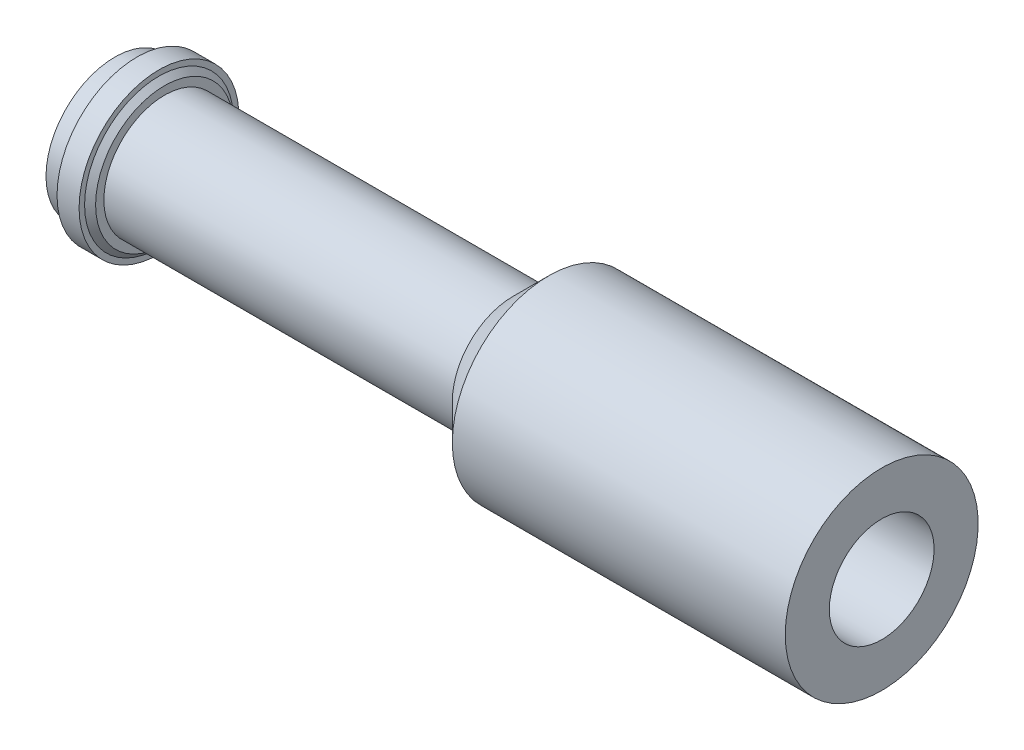
ISO-10303-21;
HEADER;
FILE_DESCRIPTION(('STEP AP214'),'2;1');
FILE_NAME('part.step','',(''),(''),'','','');
FILE_SCHEMA(('AUTOMOTIVE_DESIGN { 1 0 10303 214 1 1 1 1 }'));
ENDSEC;
DATA;
#1=APPLICATION_CONTEXT('core data for automotive mechanical design processes');
#2=APPLICATION_PROTOCOL_DEFINITION('international standard','automotive_design',2000,#1);
#3=PRODUCT_CONTEXT('',#1,'mechanical');
#4=PRODUCT('Part','Part','',(#3));
#5=PRODUCT_RELATED_PRODUCT_CATEGORY('part','',(#4));
#6=PRODUCT_DEFINITION_FORMATION('','',#4);
#7=PRODUCT_DEFINITION_CONTEXT('part definition',#1,'design');
#8=PRODUCT_DEFINITION('design','',#6,#7);
#9=PRODUCT_DEFINITION_SHAPE('','',#8);
#10=(LENGTH_UNIT() NAMED_UNIT(*) SI_UNIT(.MILLI.,.METRE.));
#11=(NAMED_UNIT(*) PLANE_ANGLE_UNIT() SI_UNIT($,.RADIAN.));
#12=(NAMED_UNIT(*) SI_UNIT($,.STERADIAN.) SOLID_ANGLE_UNIT());
#13=UNCERTAINTY_MEASURE_WITH_UNIT(LENGTH_MEASURE(1.E-05),#10,'distance_accuracy_value','');
#14=(GEOMETRIC_REPRESENTATION_CONTEXT(3) GLOBAL_UNCERTAINTY_ASSIGNED_CONTEXT((#13)) GLOBAL_UNIT_ASSIGNED_CONTEXT((#10,
#11,#12)) REPRESENTATION_CONTEXT('',''));
#15=CARTESIAN_POINT('',(0.,0.,0.));
#16=DIRECTION('',(0.,0.,1.));
#17=DIRECTION('',(1.,0.,0.));
#18=AXIS2_PLACEMENT_3D('',#15,#16,#17);
#19=CARTESIAN_POINT('',(8.,0.,0.));
#20=DIRECTION('',(-1.,0.,0.));
#21=DIRECTION('',(0.,0.,1.));
#22=AXIS2_PLACEMENT_3D('',#19,#20,#21);
#23=CONICAL_SURFACE('',#22,13.5,0.785398163397446);
#24=CARTESIAN_POINT('',(8.,0.,0.));
#25=DIRECTION('',(-1.,0.,0.));
#26=DIRECTION('',(0.,0.,1.));
#27=AXIS2_PLACEMENT_3D('',#24,#25,#26);
#28=CIRCLE('',#27,13.5);
#29=CARTESIAN_POINT('',(8.,0.,13.5));
#30=VERTEX_POINT('',#29);
#31=EDGE_CURVE('E17',#30,#30,#28,.F.);
#32=ORIENTED_EDGE('',*,*,#31,.T.);
#33=EDGE_LOOP('',(#32));
#34=FACE_BOUND('',#33,.T.);
#35=CARTESIAN_POINT('',(9.,0.,0.));
#36=DIRECTION('',(-1.,0.,0.));
#37=DIRECTION('',(0.,0.,1.));
#38=AXIS2_PLACEMENT_3D('',#35,#36,#37);
#39=CIRCLE('',#38,12.5);
#40=CARTESIAN_POINT('',(9.,0.,12.5));
#41=VERTEX_POINT('',#40);
#42=EDGE_CURVE('E49',#41,#41,#39,.T.);
#43=ORIENTED_EDGE('',*,*,#42,.T.);
#44=EDGE_LOOP('',(#43));
#45=FACE_BOUND('',#44,.T.);
#46=ADVANCED_FACE('F14',(#34,#45),#23,.T.);
#47=CARTESIAN_POINT('',(8.,14.5,0.));
#48=DIRECTION('',(-1.,0.,0.));
#49=DIRECTION('',(0.,0.,1.));
#50=AXIS2_PLACEMENT_3D('',#47,#48,#49);
#51=PLANE('',#50);
#52=ORIENTED_EDGE('',*,*,#31,.F.);
#53=EDGE_LOOP('',(#52));
#54=FACE_BOUND('',#53,.T.);
#55=CARTESIAN_POINT('',(8.,0.,0.));
#56=DIRECTION('',(-1.,0.,0.));
#57=DIRECTION('',(0.,0.,1.));
#58=AXIS2_PLACEMENT_3D('',#55,#56,#57);
#59=CIRCLE('',#58,14.5);
#60=CARTESIAN_POINT('',(8.,0.,14.5));
#61=VERTEX_POINT('',#60);
#62=EDGE_CURVE('E47',#61,#61,#59,.T.);
#63=ORIENTED_EDGE('',*,*,#62,.F.);
#64=EDGE_LOOP('',(#63));
#65=FACE_BOUND('',#64,.T.);
#66=ADVANCED_FACE('F57',(#54,#65),#51,.F.);
#67=CARTESIAN_POINT('',(9.,12.5,0.));
#68=DIRECTION('',(-1.,0.,0.));
#69=DIRECTION('',(0.,0.,1.));
#70=AXIS2_PLACEMENT_3D('',#67,#68,#69);
#71=PLANE('',#70);
#72=CARTESIAN_POINT('',(9.,0.,0.));
#73=DIRECTION('',(-1.,0.,0.));
#74=DIRECTION('',(0.,0.,1.));
#75=AXIS2_PLACEMENT_3D('',#72,#73,#74);
#76=CIRCLE('',#75,11.);
#77=CARTESIAN_POINT('',(9.,0.,11.));
#78=VERTEX_POINT('',#77);
#79=EDGE_CURVE('E44',#78,#78,#76,.F.);
#80=ORIENTED_EDGE('',*,*,#79,.F.);
#81=EDGE_LOOP('',(#80));
#82=FACE_BOUND('',#81,.T.);
#83=ORIENTED_EDGE('',*,*,#42,.F.);
#84=EDGE_LOOP('',(#83));
#85=FACE_BOUND('',#84,.T.);
#86=ADVANCED_FACE('F60',(#82,#85),#71,.F.);
#87=CARTESIAN_POINT('',(0.,0.,0.));
#88=DIRECTION('',(-1.,0.,0.));
#89=DIRECTION('',(0.,0.,1.));
#90=AXIS2_PLACEMENT_3D('',#87,#88,#89);
#91=CYLINDRICAL_SURFACE('',#90,14.5);
#92=CARTESIAN_POINT('',(4.,0.,0.));
#93=DIRECTION('',(-1.,0.,0.));
#94=DIRECTION('',(0.,0.,1.));
#95=AXIS2_PLACEMENT_3D('',#92,#93,#94);
#96=CIRCLE('',#95,14.5);
#97=CARTESIAN_POINT('',(4.,0.,14.5));
#98=VERTEX_POINT('',#97);
#99=EDGE_CURVE('E41',#98,#98,#96,.F.);
#100=ORIENTED_EDGE('',*,*,#99,.T.);
#101=EDGE_LOOP('',(#100));
#102=FACE_BOUND('',#101,.T.);
#103=ORIENTED_EDGE('',*,*,#62,.T.);
#104=EDGE_LOOP('',(#103));
#105=FACE_BOUND('',#104,.T.);
#106=ADVANCED_FACE('F63',(#102,#105),#91,.T.);
#107=CARTESIAN_POINT('',(0.,0.,0.));
#108=DIRECTION('',(-1.,0.,0.));
#109=DIRECTION('',(0.,0.,1.));
#110=AXIS2_PLACEMENT_3D('',#107,#108,#109);
#111=CYLINDRICAL_SURFACE('',#110,11.);
#112=ORIENTED_EDGE('',*,*,#79,.T.);
#113=EDGE_LOOP('',(#112));
#114=FACE_BOUND('',#113,.T.);
#115=CARTESIAN_POINT('',(72.22,0.,0.));
#116=DIRECTION('',(1.,0.,0.));
#117=DIRECTION('',(0.,0.,-1.));
#118=AXIS2_PLACEMENT_3D('',#115,#116,#117);
#119=CIRCLE('',#118,11.);
#120=CARTESIAN_POINT('',(72.22,0.,-11.));
#121=VERTEX_POINT('',#120);
#122=EDGE_CURVE('E29',#121,#121,#119,.T.);
#123=ORIENTED_EDGE('',*,*,#122,.F.);
#124=EDGE_LOOP('',(#123));
#125=FACE_BOUND('',#124,.T.);
#126=ADVANCED_FACE('F65',(#114,#125),#111,.T.);
#127=CARTESIAN_POINT('',(4.,12.5,0.));
#128=DIRECTION('',(1.,0.,0.));
#129=DIRECTION('',(0.,0.,-1.));
#130=AXIS2_PLACEMENT_3D('',#127,#128,#129);
#131=PLANE('',#130);
#132=ORIENTED_EDGE('',*,*,#99,.F.);
#133=EDGE_LOOP('',(#132));
#134=FACE_BOUND('',#133,.T.);
#135=CARTESIAN_POINT('',(4.,0.,0.));
#136=DIRECTION('',(-1.,0.,0.));
#137=DIRECTION('',(0.,0.,1.));
#138=AXIS2_PLACEMENT_3D('',#135,#136,#137);
#139=CIRCLE('',#138,12.5);
#140=CARTESIAN_POINT('',(4.,0.,12.5));
#141=VERTEX_POINT('',#140);
#142=EDGE_CURVE('E38',#141,#141,#139,.T.);
#143=ORIENTED_EDGE('',*,*,#142,.F.);
#144=EDGE_LOOP('',(#143));
#145=FACE_BOUND('',#144,.T.);
#146=ADVANCED_FACE('F73',(#134,#145),#131,.F.);
#147=CARTESIAN_POINT('',(78.72,0.,0.));
#148=DIRECTION('',(1.,0.,0.));
#149=DIRECTION('',(0.,0.,-1.));
#150=AXIS2_PLACEMENT_3D('',#147,#148,#149);
#151=CONICAL_SURFACE('',#150,17.5,0.78539816339745);
#152=CARTESIAN_POINT('',(78.72,0.,0.));
#153=DIRECTION('',(-1.,0.,0.));
#154=DIRECTION('',(0.,0.,1.));
#155=AXIS2_PLACEMENT_3D('',#152,#153,#154);
#156=CIRCLE('',#155,17.5);
#157=CARTESIAN_POINT('',(78.72,0.,17.5));
#158=VERTEX_POINT('',#157);
#159=EDGE_CURVE('E37',#158,#158,#156,.F.);
#160=ORIENTED_EDGE('',*,*,#159,.F.);
#161=EDGE_LOOP('',(#160));
#162=FACE_BOUND('',#161,.T.);
#163=ORIENTED_EDGE('',*,*,#122,.T.);
#164=EDGE_LOOP('',(#163));
#165=FACE_BOUND('',#164,.T.);
#166=ADVANCED_FACE('F101',(#162,#165),#151,.T.);
#167=CARTESIAN_POINT('',(0.,0.,0.));
#168=DIRECTION('',(-1.,0.,0.));
#169=DIRECTION('',(0.,0.,1.));
#170=AXIS2_PLACEMENT_3D('',#167,#168,#169);
#171=CYLINDRICAL_SURFACE('',#170,12.5);
#172=CARTESIAN_POINT('',(0.,0.,0.));
#173=DIRECTION('',(-1.,0.,0.));
#174=DIRECTION('',(0.,0.,1.));
#175=AXIS2_PLACEMENT_3D('',#172,#173,#174);
#176=CIRCLE('',#175,12.5);
#177=CARTESIAN_POINT('',(0.,0.,12.5));
#178=VERTEX_POINT('',#177);
#179=EDGE_CURVE('E34',#178,#178,#176,.F.);
#180=ORIENTED_EDGE('',*,*,#179,.T.);
#181=EDGE_LOOP('',(#180));
#182=FACE_BOUND('',#181,.T.);
#183=ORIENTED_EDGE('',*,*,#142,.T.);
#184=EDGE_LOOP('',(#183));
#185=FACE_BOUND('',#184,.T.);
#186=ADVANCED_FACE('F97',(#182,#185),#171,.T.);
#187=CARTESIAN_POINT('',(0.,0.,0.));
#188=DIRECTION('',(-1.,0.,0.));
#189=DIRECTION('',(0.,0.,1.));
#190=AXIS2_PLACEMENT_3D('',#187,#188,#189);
#191=CYLINDRICAL_SURFACE('',#190,17.5);
#192=ORIENTED_EDGE('',*,*,#159,.T.);
#193=EDGE_LOOP('',(#192));
#194=FACE_BOUND('',#193,.T.);
#195=CARTESIAN_POINT('',(139.12,0.,0.));
#196=DIRECTION('',(-1.,0.,0.));
#197=DIRECTION('',(0.,0.,1.));
#198=AXIS2_PLACEMENT_3D('',#195,#196,#197);
#199=CIRCLE('',#198,17.5);
#200=CARTESIAN_POINT('',(139.12,0.,17.5));
#201=VERTEX_POINT('',#200);
#202=EDGE_CURVE('E26',#201,#201,#199,.T.);
#203=ORIENTED_EDGE('',*,*,#202,.T.);
#204=EDGE_LOOP('',(#203));
#205=FACE_BOUND('',#204,.T.);
#206=ADVANCED_FACE('F93',(#194,#205),#191,.T.);
#207=CARTESIAN_POINT('',(0.,9.5,0.));
#208=DIRECTION('',(1.,0.,0.));
#209=DIRECTION('',(0.,0.,-1.));
#210=AXIS2_PLACEMENT_3D('',#207,#208,#209);
#211=PLANE('',#210);
#212=ORIENTED_EDGE('',*,*,#179,.F.);
#213=EDGE_LOOP('',(#212));
#214=FACE_BOUND('',#213,.T.);
#215=CARTESIAN_POINT('',(0.,0.,0.));
#216=DIRECTION('',(-1.,0.,0.));
#217=DIRECTION('',(0.,0.,1.));
#218=AXIS2_PLACEMENT_3D('',#215,#216,#217);
#219=CIRCLE('',#218,9.5);
#220=CARTESIAN_POINT('',(0.,0.,9.5));
#221=VERTEX_POINT('',#220);
#222=EDGE_CURVE('E21',#221,#221,#219,.F.);
#223=ORIENTED_EDGE('',*,*,#222,.T.);
#224=EDGE_LOOP('',(#223));
#225=FACE_BOUND('',#224,.T.);
#226=ADVANCED_FACE('F86',(#214,#225),#211,.F.);
#227=CARTESIAN_POINT('',(139.12,17.5,0.));
#228=DIRECTION('',(-1.,0.,0.));
#229=DIRECTION('',(0.,0.,1.));
#230=AXIS2_PLACEMENT_3D('',#227,#228,#229);
#231=PLANE('',#230);
#232=CARTESIAN_POINT('',(139.12,0.,0.));
#233=DIRECTION('',(-1.,0.,0.));
#234=DIRECTION('',(0.,0.,1.));
#235=AXIS2_PLACEMENT_3D('',#232,#233,#234);
#236=CIRCLE('',#235,9.5);
#237=CARTESIAN_POINT('',(139.12,0.,9.5));
#238=VERTEX_POINT('',#237);
#239=EDGE_CURVE('E10',#238,#238,#236,.T.);
#240=ORIENTED_EDGE('',*,*,#239,.T.);
#241=EDGE_LOOP('',(#240));
#242=FACE_BOUND('',#241,.T.);
#243=ORIENTED_EDGE('',*,*,#202,.F.);
#244=EDGE_LOOP('',(#243));
#245=FACE_BOUND('',#244,.T.);
#246=ADVANCED_FACE('F80',(#242,#245),#231,.F.);
#247=CARTESIAN_POINT('',(0.,0.,0.));
#248=DIRECTION('',(-1.,0.,0.));
#249=DIRECTION('',(0.,0.,1.));
#250=AXIS2_PLACEMENT_3D('',#247,#248,#249);
#251=CYLINDRICAL_SURFACE('',#250,9.5);
#252=ORIENTED_EDGE('',*,*,#222,.F.);
#253=EDGE_LOOP('',(#252));
#254=FACE_BOUND('',#253,.T.);
#255=ORIENTED_EDGE('',*,*,#239,.F.);
#256=EDGE_LOOP('',(#255));
#257=FACE_BOUND('',#256,.T.);
#258=ADVANCED_FACE('F78',(#254,#257),#251,.F.);
#259=CLOSED_SHELL('',(#46,#66,#86,#106,#126,#146,#166,#186,#206,#226,#246,#258));
#260=MANIFOLD_SOLID_BREP('B1',#259);
#261=ADVANCED_BREP_SHAPE_REPRESENTATION('',(#18,#260),#14);
#262=SHAPE_DEFINITION_REPRESENTATION(#9,#261);
ENDSEC;
END-ISO-10303-21;
